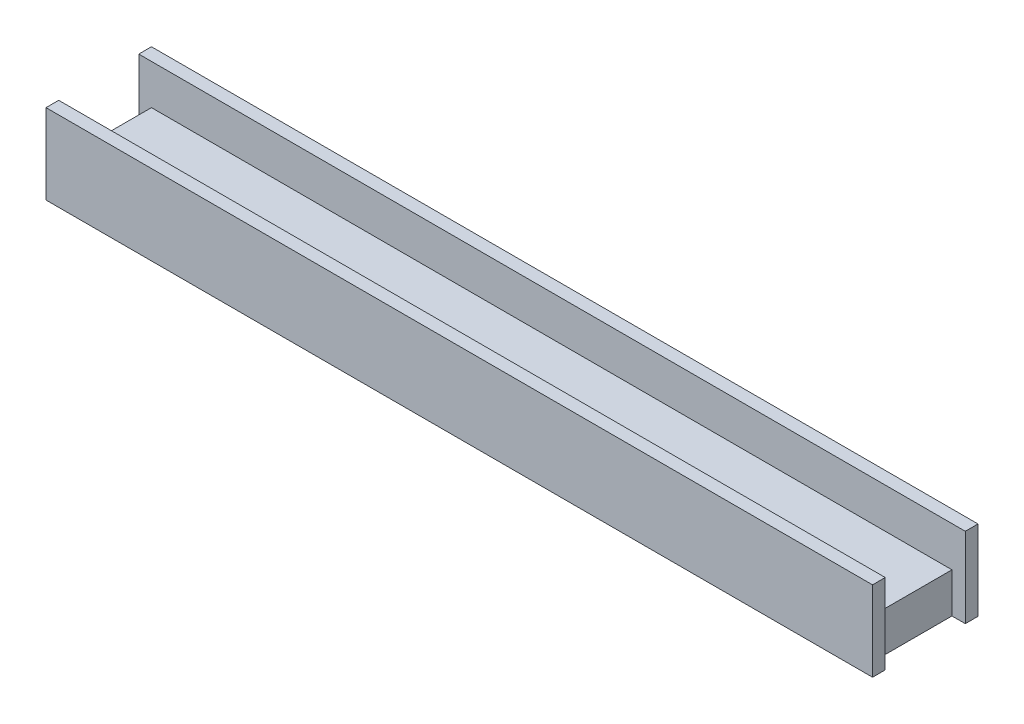
ISO-10303-21;
HEADER;
FILE_DESCRIPTION(('STEP AP214'),'2;1');
FILE_NAME('part.step','',(''),(''),'','','');
FILE_SCHEMA(('AUTOMOTIVE_DESIGN { 1 0 10303 214 1 1 1 1 }'));
ENDSEC;
DATA;
#1=APPLICATION_CONTEXT('core data for automotive mechanical design processes');
#2=APPLICATION_PROTOCOL_DEFINITION('international standard','automotive_design',2000,#1);
#3=PRODUCT_CONTEXT('',#1,'mechanical');
#4=PRODUCT('Part','Part','',(#3));
#5=PRODUCT_RELATED_PRODUCT_CATEGORY('part','',(#4));
#6=PRODUCT_DEFINITION_FORMATION('','',#4);
#7=PRODUCT_DEFINITION_CONTEXT('part definition',#1,'design');
#8=PRODUCT_DEFINITION('design','',#6,#7);
#9=PRODUCT_DEFINITION_SHAPE('','',#8);
#10=(LENGTH_UNIT() NAMED_UNIT(*) SI_UNIT(.MILLI.,.METRE.));
#11=(NAMED_UNIT(*) PLANE_ANGLE_UNIT() SI_UNIT($,.RADIAN.));
#12=(NAMED_UNIT(*) SI_UNIT($,.STERADIAN.) SOLID_ANGLE_UNIT());
#13=UNCERTAINTY_MEASURE_WITH_UNIT(LENGTH_MEASURE(1.E-05),#10,'distance_accuracy_value','');
#14=(GEOMETRIC_REPRESENTATION_CONTEXT(3) GLOBAL_UNCERTAINTY_ASSIGNED_CONTEXT((#13)) GLOBAL_UNIT_ASSIGNED_CONTEXT((#10,
#11,#12)) REPRESENTATION_CONTEXT('',''));
#15=CARTESIAN_POINT('',(0.,0.,0.));
#16=DIRECTION('',(0.,0.,1.));
#17=DIRECTION('',(1.,0.,0.));
#18=AXIS2_PLACEMENT_3D('',#15,#16,#17);
#19=CARTESIAN_POINT('',(50.83283900378,5.,4.999999906));
#20=DIRECTION('',(1.,0.,0.));
#21=DIRECTION('',(0.,0.,-1.));
#22=AXIS2_PLACEMENT_3D('',#19,#20,#21);
#23=PLANE('',#22);
#24=DIRECTION('',(0.,0.,1.));
#25=VECTOR('',#24,1.);
#26=CARTESIAN_POINT('',(50.83283900378,0.,4.999999906));
#27=LINE('',#26,#25);
#28=CARTESIAN_POINT('',(50.83283900378,0.,4.999999906));
#29=VERTEX_POINT('',#28);
#30=CARTESIAN_POINT('',(50.83283900378,0.,5.79374990599999));
#31=VERTEX_POINT('',#30);
#32=EDGE_CURVE('E12',#29,#31,#27,.T.);
#33=ORIENTED_EDGE('',*,*,#32,.F.);
#34=DIRECTION('',(0.,-1.,0.));
#35=VECTOR('',#34,1.);
#36=CARTESIAN_POINT('',(50.83283900378,5.,4.999999906));
#37=LINE('',#36,#35);
#38=CARTESIAN_POINT('',(50.83283900378,5.,4.999999906));
#39=VERTEX_POINT('',#38);
#40=EDGE_CURVE('E105',#39,#29,#37,.T.);
#41=ORIENTED_EDGE('',*,*,#40,.F.);
#42=DIRECTION('',(0.,0.,1.));
#43=VECTOR('',#42,1.);
#44=CARTESIAN_POINT('',(50.83283900378,5.,4.999999906));
#45=LINE('',#44,#43);
#46=CARTESIAN_POINT('',(50.83283900378,5.,5.79374990599999));
#47=VERTEX_POINT('',#46);
#48=EDGE_CURVE('E62',#39,#47,#45,.T.);
#49=ORIENTED_EDGE('',*,*,#48,.T.);
#50=DIRECTION('',(0.,-1.,0.));
#51=VECTOR('',#50,1.);
#52=CARTESIAN_POINT('',(50.83283900378,5.,5.79374990599999));
#53=LINE('',#52,#51);
#54=EDGE_CURVE('E77',#47,#31,#53,.T.);
#55=ORIENTED_EDGE('',*,*,#54,.T.);
#56=EDGE_LOOP('',(#33,#41,#49,#55));
#57=FACE_BOUND('',#56,.T.);
#58=ADVANCED_FACE('F58',(#57),#23,.T.);
#59=CARTESIAN_POINT('',(-0.792660996219982,5.,4.999999906));
#60=DIRECTION('',(0.,0.,-1.));
#61=DIRECTION('',(-1.,0.,0.));
#62=AXIS2_PLACEMENT_3D('',#59,#60,#61);
#63=PLANE('',#62);
#64=DIRECTION('',(1.,0.,0.));
#65=VECTOR('',#64,1.);
#66=CARTESIAN_POINT('',(-0.792660996219982,0.,4.999999906));
#67=LINE('',#66,#65);
#68=CARTESIAN_POINT('',(-0.792660996219982,0.,4.999999906));
#69=VERTEX_POINT('',#68);
#70=EDGE_CURVE('E118',#69,#29,#67,.T.);
#71=ORIENTED_EDGE('',*,*,#70,.F.);
#72=DIRECTION('',(0.,-1.,0.));
#73=VECTOR('',#72,1.);
#74=CARTESIAN_POINT('',(-0.792660996219982,5.,4.999999906));
#75=LINE('',#74,#73);
#76=CARTESIAN_POINT('',(-0.792660996219982,5.,4.999999906));
#77=VERTEX_POINT('',#76);
#78=EDGE_CURVE('E107',#77,#69,#75,.T.);
#79=ORIENTED_EDGE('',*,*,#78,.F.);
#80=DIRECTION('',(1.,0.,0.));
#81=VECTOR('',#80,1.);
#82=CARTESIAN_POINT('',(-0.792660996219982,5.,4.999999906));
#83=LINE('',#82,#81);
#84=EDGE_CURVE('E126',#77,#39,#83,.T.);
#85=ORIENTED_EDGE('',*,*,#84,.T.);
#86=ORIENTED_EDGE('',*,*,#40,.T.);
#87=EDGE_LOOP('',(#71,#79,#85,#86));
#88=FACE_BOUND('',#87,.T.);
#89=ADVANCED_FACE('F120',(#88),#63,.T.);
#90=CARTESIAN_POINT('',(-0.792660996219982,5.,5.793749906));
#91=DIRECTION('',(-1.,0.,0.));
#92=DIRECTION('',(0.,0.,1.));
#93=AXIS2_PLACEMENT_3D('',#90,#91,#92);
#94=PLANE('',#93);
#95=DIRECTION('',(0.,0.,-1.));
#96=VECTOR('',#95,1.);
#97=CARTESIAN_POINT('',(-0.792660996219982,0.,5.793749906));
#98=LINE('',#97,#96);
#99=CARTESIAN_POINT('',(-0.792660996219982,0.,5.793749906));
#100=VERTEX_POINT('',#99);
#101=EDGE_CURVE('E110',#100,#69,#98,.T.);
#102=ORIENTED_EDGE('',*,*,#101,.F.);
#103=DIRECTION('',(0.,-1.,0.));
#104=VECTOR('',#103,1.);
#105=CARTESIAN_POINT('',(-0.792660996219982,5.,5.793749906));
#106=LINE('',#105,#104);
#107=CARTESIAN_POINT('',(-0.792660996219982,5.,5.793749906));
#108=VERTEX_POINT('',#107);
#109=EDGE_CURVE('E94',#108,#100,#106,.T.);
#110=ORIENTED_EDGE('',*,*,#109,.F.);
#111=DIRECTION('',(0.,0.,-1.));
#112=VECTOR('',#111,1.);
#113=CARTESIAN_POINT('',(-0.792660996219982,5.,5.793749906));
#114=LINE('',#113,#112);
#115=EDGE_CURVE('E112',#108,#77,#114,.T.);
#116=ORIENTED_EDGE('',*,*,#115,.T.);
#117=ORIENTED_EDGE('',*,*,#78,.T.);
#118=EDGE_LOOP('',(#102,#110,#116,#117));
#119=FACE_BOUND('',#118,.T.);
#120=ADVANCED_FACE('F109',(#119),#94,.T.);
#121=CARTESIAN_POINT('',(50.83283900378,5.,5.79374990599999));
#122=DIRECTION('',(0.,0.,1.));
#123=DIRECTION('',(1.,0.,0.));
#124=AXIS2_PLACEMENT_3D('',#121,#122,#123);
#125=PLANE('',#124);
#126=DIRECTION('',(-1.,0.,0.));
#127=VECTOR('',#126,1.);
#128=CARTESIAN_POINT('',(50.83283900378,0.,5.79374990599999));
#129=LINE('',#128,#127);
#130=EDGE_CURVE('E68',#31,#100,#129,.T.);
#131=ORIENTED_EDGE('',*,*,#130,.F.);
#132=ORIENTED_EDGE('',*,*,#54,.F.);
#133=DIRECTION('',(-1.,0.,0.));
#134=VECTOR('',#133,1.);
#135=CARTESIAN_POINT('',(50.83283900378,5.,5.79374990599999));
#136=LINE('',#135,#134);
#137=EDGE_CURVE('E122',#47,#108,#136,.T.);
#138=ORIENTED_EDGE('',*,*,#137,.T.);
#139=ORIENTED_EDGE('',*,*,#109,.T.);
#140=EDGE_LOOP('',(#131,#132,#138,#139));
#141=FACE_BOUND('',#140,.T.);
#142=ADVANCED_FACE('F128',(#141),#125,.T.);
#143=CARTESIAN_POINT('',(0.,5.,0.));
#144=DIRECTION('',(0.,-1.,0.));
#145=DIRECTION('',(0.,0.,-1.));
#146=AXIS2_PLACEMENT_3D('',#143,#144,#145);
#147=PLANE('',#146);
#148=ORIENTED_EDGE('',*,*,#48,.F.);
#149=ORIENTED_EDGE('',*,*,#84,.F.);
#150=ORIENTED_EDGE('',*,*,#115,.F.);
#151=ORIENTED_EDGE('',*,*,#137,.F.);
#152=EDGE_LOOP('',(#148,#149,#150,#151));
#153=FACE_BOUND('',#152,.T.);
#154=ADVANCED_FACE('F60',(#153),#147,.F.);
#155=CARTESIAN_POINT('',(0.,0.,0.));
#156=DIRECTION('',(0.,-1.,0.));
#157=DIRECTION('',(0.,0.,-1.));
#158=AXIS2_PLACEMENT_3D('',#155,#156,#157);
#159=PLANE('',#158);
#160=ORIENTED_EDGE('',*,*,#32,.T.);
#161=ORIENTED_EDGE('',*,*,#130,.T.);
#162=ORIENTED_EDGE('',*,*,#101,.T.);
#163=ORIENTED_EDGE('',*,*,#70,.T.);
#164=EDGE_LOOP('',(#160,#161,#162,#163));
#165=FACE_BOUND('',#164,.T.);
#166=ADVANCED_FACE('F117',(#165),#159,.T.);
#167=CLOSED_SHELL('',(#58,#89,#120,#142,#154,#166));
#168=MANIFOLD_SOLID_BREP('B2',#167);
#169=CARTESIAN_POINT('',(50.83283900378,5.,0.));
#170=DIRECTION('',(1.,0.,0.));
#171=DIRECTION('',(0.,0.,-1.));
#172=AXIS2_PLACEMENT_3D('',#169,#170,#171);
#173=PLANE('',#172);
#174=DIRECTION('',(0.,0.,1.));
#175=VECTOR('',#174,1.);
#176=CARTESIAN_POINT('',(50.83283900378,0.,0.));
#177=LINE('',#176,#175);
#178=CARTESIAN_POINT('',(50.83283900378,0.,-0.79375));
#179=VERTEX_POINT('',#178);
#180=CARTESIAN_POINT('',(50.83283900378,0.,0.));
#181=VERTEX_POINT('',#180);
#182=EDGE_CURVE('E272',#179,#181,#177,.T.);
#183=ORIENTED_EDGE('',*,*,#182,.F.);
#184=DIRECTION('',(0.,-1.,0.));
#185=VECTOR('',#184,1.);
#186=CARTESIAN_POINT('',(50.83283900378,5.,-0.79375));
#187=LINE('',#186,#185);
#188=CARTESIAN_POINT('',(50.83283900378,5.,-0.79375));
#189=VERTEX_POINT('',#188);
#190=EDGE_CURVE('E56',#189,#179,#187,.T.);
#191=ORIENTED_EDGE('',*,*,#190,.F.);
#192=DIRECTION('',(0.,0.,1.));
#193=VECTOR('',#192,1.);
#194=CARTESIAN_POINT('',(50.83283900378,5.,0.));
#195=LINE('',#194,#193);
#196=CARTESIAN_POINT('',(50.83283900378,5.,0.));
#197=VERTEX_POINT('',#196);
#198=EDGE_CURVE('E263',#189,#197,#195,.T.);
#199=ORIENTED_EDGE('',*,*,#198,.T.);
#200=DIRECTION('',(0.,-1.,0.));
#201=VECTOR('',#200,1.);
#202=CARTESIAN_POINT('',(50.83283900378,5.,0.));
#203=LINE('',#202,#201);
#204=EDGE_CURVE('E242',#197,#181,#203,.T.);
#205=ORIENTED_EDGE('',*,*,#204,.T.);
#206=EDGE_LOOP('',(#183,#191,#199,#205));
#207=FACE_BOUND('',#206,.T.);
#208=ADVANCED_FACE('F203',(#207),#173,.T.);
#209=CARTESIAN_POINT('',(0.,5.,-0.79375));
#210=DIRECTION('',(0.,0.,-1.));
#211=DIRECTION('',(-1.,0.,0.));
#212=AXIS2_PLACEMENT_3D('',#209,#210,#211);
#213=PLANE('',#212);
#214=DIRECTION('',(1.,0.,0.));
#215=VECTOR('',#214,1.);
#216=CARTESIAN_POINT('',(0.,0.,-0.79375));
#217=LINE('',#216,#215);
#218=CARTESIAN_POINT('',(-0.792660996219982,0.,-0.79375));
#219=VERTEX_POINT('',#218);
#220=EDGE_CURVE('E255',#219,#179,#217,.T.);
#221=ORIENTED_EDGE('',*,*,#220,.F.);
#222=DIRECTION('',(0.,-1.,0.));
#223=VECTOR('',#222,1.);
#224=CARTESIAN_POINT('',(-0.792660996219982,5.,-0.79375));
#225=LINE('',#224,#223);
#226=CARTESIAN_POINT('',(-0.792660996219982,5.,-0.79375));
#227=VERTEX_POINT('',#226);
#228=EDGE_CURVE('E212',#227,#219,#225,.T.);
#229=ORIENTED_EDGE('',*,*,#228,.F.);
#230=DIRECTION('',(1.,0.,0.));
#231=VECTOR('',#230,1.);
#232=CARTESIAN_POINT('',(0.,5.,-0.79375));
#233=LINE('',#232,#231);
#234=EDGE_CURVE('E253',#227,#189,#233,.T.);
#235=ORIENTED_EDGE('',*,*,#234,.T.);
#236=ORIENTED_EDGE('',*,*,#190,.T.);
#237=EDGE_LOOP('',(#221,#229,#235,#236));
#238=FACE_BOUND('',#237,.T.);
#239=ADVANCED_FACE('F251',(#238),#213,.T.);
#240=CARTESIAN_POINT('',(-0.792660996219982,5.,0.));
#241=DIRECTION('',(1.,0.,0.));
#242=DIRECTION('',(0.,0.,-1.));
#243=AXIS2_PLACEMENT_3D('',#240,#241,#242);
#244=PLANE('',#243);
#245=DIRECTION('',(0.,0.,1.));
#246=VECTOR('',#245,1.);
#247=CARTESIAN_POINT('',(-0.792660996219982,0.,0.));
#248=LINE('',#247,#246);
#249=CARTESIAN_POINT('',(-0.792660996219982,0.,0.));
#250=VERTEX_POINT('',#249);
#251=EDGE_CURVE('E235',#219,#250,#248,.T.);
#252=ORIENTED_EDGE('',*,*,#251,.T.);
#253=DIRECTION('',(0.,-1.,0.));
#254=VECTOR('',#253,1.);
#255=CARTESIAN_POINT('',(-0.792660996219982,5.,0.));
#256=LINE('',#255,#254);
#257=CARTESIAN_POINT('',(-0.792660996219982,5.,0.));
#258=VERTEX_POINT('',#257);
#259=EDGE_CURVE('E257',#258,#250,#256,.T.);
#260=ORIENTED_EDGE('',*,*,#259,.F.);
#261=DIRECTION('',(0.,0.,1.));
#262=VECTOR('',#261,1.);
#263=CARTESIAN_POINT('',(-0.792660996219982,5.,0.));
#264=LINE('',#263,#262);
#265=EDGE_CURVE('E258',#227,#258,#264,.T.);
#266=ORIENTED_EDGE('',*,*,#265,.F.);
#267=ORIENTED_EDGE('',*,*,#228,.T.);
#268=EDGE_LOOP('',(#252,#260,#266,#267));
#269=FACE_BOUND('',#268,.T.);
#270=ADVANCED_FACE('F259',(#269),#244,.F.);
#271=CARTESIAN_POINT('',(0.,5.,0.));
#272=DIRECTION('',(0.,0.,-1.));
#273=DIRECTION('',(-1.,0.,0.));
#274=AXIS2_PLACEMENT_3D('',#271,#272,#273);
#275=PLANE('',#274);
#276=DIRECTION('',(1.,0.,0.));
#277=VECTOR('',#276,1.);
#278=CARTESIAN_POINT('',(0.,0.,0.));
#279=LINE('',#278,#277);
#280=EDGE_CURVE('E267',#250,#181,#279,.T.);
#281=ORIENTED_EDGE('',*,*,#280,.T.);
#282=ORIENTED_EDGE('',*,*,#204,.F.);
#283=DIRECTION('',(1.,0.,0.));
#284=VECTOR('',#283,1.);
#285=CARTESIAN_POINT('',(0.,5.,0.));
#286=LINE('',#285,#284);
#287=EDGE_CURVE('E220',#258,#197,#286,.T.);
#288=ORIENTED_EDGE('',*,*,#287,.F.);
#289=ORIENTED_EDGE('',*,*,#259,.T.);
#290=EDGE_LOOP('',(#281,#282,#288,#289));
#291=FACE_BOUND('',#290,.T.);
#292=ADVANCED_FACE('F287',(#291),#275,.F.);
#293=CARTESIAN_POINT('',(0.,5.,0.));
#294=DIRECTION('',(0.,1.,0.));
#295=DIRECTION('',(0.,0.,1.));
#296=AXIS2_PLACEMENT_3D('',#293,#294,#295);
#297=PLANE('',#296);
#298=ORIENTED_EDGE('',*,*,#198,.F.);
#299=ORIENTED_EDGE('',*,*,#234,.F.);
#300=ORIENTED_EDGE('',*,*,#265,.T.);
#301=ORIENTED_EDGE('',*,*,#287,.T.);
#302=EDGE_LOOP('',(#298,#299,#300,#301));
#303=FACE_BOUND('',#302,.T.);
#304=ADVANCED_FACE('F262',(#303),#297,.T.);
#305=CARTESIAN_POINT('',(0.,0.,0.));
#306=DIRECTION('',(0.,1.,0.));
#307=DIRECTION('',(0.,0.,1.));
#308=AXIS2_PLACEMENT_3D('',#305,#306,#307);
#309=PLANE('',#308);
#310=ORIENTED_EDGE('',*,*,#182,.T.);
#311=ORIENTED_EDGE('',*,*,#280,.F.);
#312=ORIENTED_EDGE('',*,*,#251,.F.);
#313=ORIENTED_EDGE('',*,*,#220,.T.);
#314=EDGE_LOOP('',(#310,#311,#312,#313));
#315=FACE_BOUND('',#314,.T.);
#316=ADVANCED_FACE('F289',(#315),#309,.F.);
#317=CLOSED_SHELL('',(#208,#239,#270,#292,#304,#316));
#318=MANIFOLD_SOLID_BREP('B6',#317);
#319=CARTESIAN_POINT('',(50.,2.5,0.));
#320=DIRECTION('',(1.,0.,0.));
#321=DIRECTION('',(0.,0.,-1.));
#322=AXIS2_PLACEMENT_3D('',#319,#320,#321);
#323=PLANE('',#322);
#324=DIRECTION('',(0.,0.,1.));
#325=VECTOR('',#324,1.);
#326=CARTESIAN_POINT('',(50.,0.,0.));
#327=LINE('',#326,#325);
#328=CARTESIAN_POINT('',(50.,0.,0.));
#329=VERTEX_POINT('',#328);
#330=CARTESIAN_POINT('',(50.,0.,4.999999906));
#331=VERTEX_POINT('',#330);
#332=EDGE_CURVE('E417',#329,#331,#327,.T.);
#333=ORIENTED_EDGE('',*,*,#332,.F.);
#334=DIRECTION('',(0.,-1.,0.));
#335=VECTOR('',#334,1.);
#336=CARTESIAN_POINT('',(50.,2.5,0.));
#337=LINE('',#336,#335);
#338=CARTESIAN_POINT('',(50.,2.5,0.));
#339=VERTEX_POINT('',#338);
#340=EDGE_CURVE('E201',#339,#329,#337,.T.);
#341=ORIENTED_EDGE('',*,*,#340,.F.);
#342=DIRECTION('',(0.,0.,1.));
#343=VECTOR('',#342,1.);
#344=CARTESIAN_POINT('',(50.,2.5,0.));
#345=LINE('',#344,#343);
#346=CARTESIAN_POINT('',(50.,2.5,4.999999906));
#347=VERTEX_POINT('',#346);
#348=EDGE_CURVE('E411',#339,#347,#345,.T.);
#349=ORIENTED_EDGE('',*,*,#348,.T.);
#350=DIRECTION('',(0.,-1.,0.));
#351=VECTOR('',#350,1.);
#352=CARTESIAN_POINT('',(50.,2.5,4.999999906));
#353=LINE('',#352,#351);
#354=EDGE_CURVE('E392',#347,#331,#353,.T.);
#355=ORIENTED_EDGE('',*,*,#354,.T.);
#356=EDGE_LOOP('',(#333,#341,#349,#355));
#357=FACE_BOUND('',#356,.T.);
#358=ADVANCED_FACE('F354',(#357),#323,.T.);
#359=CARTESIAN_POINT('',(0.,2.5,0.));
#360=DIRECTION('',(0.,0.,-1.));
#361=DIRECTION('',(-1.,0.,0.));
#362=AXIS2_PLACEMENT_3D('',#359,#360,#361);
#363=PLANE('',#362);
#364=DIRECTION('',(1.,0.,0.));
#365=VECTOR('',#364,1.);
#366=CARTESIAN_POINT('',(0.,0.,0.));
#367=LINE('',#366,#365);
#368=CARTESIAN_POINT('',(0.,0.,0.));
#369=VERTEX_POINT('',#368);
#370=EDGE_CURVE('E405',#369,#329,#367,.T.);
#371=ORIENTED_EDGE('',*,*,#370,.F.);
#372=DIRECTION('',(0.,-1.,0.));
#373=VECTOR('',#372,1.);
#374=CARTESIAN_POINT('',(0.,2.5,0.));
#375=LINE('',#374,#373);
#376=CARTESIAN_POINT('',(0.,2.5,0.));
#377=VERTEX_POINT('',#376);
#378=EDGE_CURVE('E362',#377,#369,#375,.T.);
#379=ORIENTED_EDGE('',*,*,#378,.F.);
#380=DIRECTION('',(1.,0.,0.));
#381=VECTOR('',#380,1.);
#382=CARTESIAN_POINT('',(0.,2.5,0.));
#383=LINE('',#382,#381);
#384=EDGE_CURVE('E403',#377,#339,#383,.T.);
#385=ORIENTED_EDGE('',*,*,#384,.T.);
#386=ORIENTED_EDGE('',*,*,#340,.T.);
#387=EDGE_LOOP('',(#371,#379,#385,#386));
#388=FACE_BOUND('',#387,.T.);
#389=ADVANCED_FACE('F401',(#388),#363,.T.);
#390=CARTESIAN_POINT('',(0.,2.5,0.));
#391=DIRECTION('',(1.,0.,0.));
#392=DIRECTION('',(0.,0.,-1.));
#393=AXIS2_PLACEMENT_3D('',#390,#391,#392);
#394=PLANE('',#393);
#395=DIRECTION('',(0.,0.,1.));
#396=VECTOR('',#395,1.);
#397=CARTESIAN_POINT('',(0.,0.,0.));
#398=LINE('',#397,#396);
#399=CARTESIAN_POINT('',(0.,0.,4.999999906));
#400=VERTEX_POINT('',#399);
#401=EDGE_CURVE('E385',#369,#400,#398,.T.);
#402=ORIENTED_EDGE('',*,*,#401,.T.);
#403=DIRECTION('',(0.,-1.,0.));
#404=VECTOR('',#403,1.);
#405=CARTESIAN_POINT('',(0.,2.5,4.999999906));
#406=LINE('',#405,#404);
#407=CARTESIAN_POINT('',(0.,2.5,4.999999906));
#408=VERTEX_POINT('',#407);
#409=EDGE_CURVE('E406',#408,#400,#406,.T.);
#410=ORIENTED_EDGE('',*,*,#409,.F.);
#411=DIRECTION('',(0.,0.,1.));
#412=VECTOR('',#411,1.);
#413=CARTESIAN_POINT('',(0.,2.5,0.));
#414=LINE('',#413,#412);
#415=EDGE_CURVE('E407',#377,#408,#414,.T.);
#416=ORIENTED_EDGE('',*,*,#415,.F.);
#417=ORIENTED_EDGE('',*,*,#378,.T.);
#418=EDGE_LOOP('',(#402,#410,#416,#417));
#419=FACE_BOUND('',#418,.T.);
#420=ADVANCED_FACE('F408',(#419),#394,.F.);
#421=CARTESIAN_POINT('',(0.,2.5,4.999999906));
#422=DIRECTION('',(0.,0.,-1.));
#423=DIRECTION('',(-1.,0.,0.));
#424=AXIS2_PLACEMENT_3D('',#421,#422,#423);
#425=PLANE('',#424);
#426=DIRECTION('',(1.,0.,0.));
#427=VECTOR('',#426,1.);
#428=CARTESIAN_POINT('',(0.,0.,4.999999906));
#429=LINE('',#428,#427);
#430=EDGE_CURVE('E413',#400,#331,#429,.T.);
#431=ORIENTED_EDGE('',*,*,#430,.T.);
#432=ORIENTED_EDGE('',*,*,#354,.F.);
#433=DIRECTION('',(1.,0.,0.));
#434=VECTOR('',#433,1.);
#435=CARTESIAN_POINT('',(0.,2.5,4.999999906));
#436=LINE('',#435,#434);
#437=EDGE_CURVE('E370',#408,#347,#436,.T.);
#438=ORIENTED_EDGE('',*,*,#437,.F.);
#439=ORIENTED_EDGE('',*,*,#409,.T.);
#440=EDGE_LOOP('',(#431,#432,#438,#439));
#441=FACE_BOUND('',#440,.T.);
#442=ADVANCED_FACE('F426',(#441),#425,.F.);
#443=CARTESIAN_POINT('',(0.,2.5,0.));
#444=DIRECTION('',(0.,1.,0.));
#445=DIRECTION('',(0.,0.,1.));
#446=AXIS2_PLACEMENT_3D('',#443,#444,#445);
#447=PLANE('',#446);
#448=ORIENTED_EDGE('',*,*,#348,.F.);
#449=ORIENTED_EDGE('',*,*,#384,.F.);
#450=ORIENTED_EDGE('',*,*,#415,.T.);
#451=ORIENTED_EDGE('',*,*,#437,.T.);
#452=EDGE_LOOP('',(#448,#449,#450,#451));
#453=FACE_BOUND('',#452,.T.);
#454=ADVANCED_FACE('F410',(#453),#447,.T.);
#455=CARTESIAN_POINT('',(0.,0.,0.));
#456=DIRECTION('',(0.,1.,0.));
#457=DIRECTION('',(0.,0.,1.));
#458=AXIS2_PLACEMENT_3D('',#455,#456,#457);
#459=PLANE('',#458);
#460=ORIENTED_EDGE('',*,*,#332,.T.);
#461=ORIENTED_EDGE('',*,*,#430,.F.);
#462=ORIENTED_EDGE('',*,*,#401,.F.);
#463=ORIENTED_EDGE('',*,*,#370,.T.);
#464=EDGE_LOOP('',(#460,#461,#462,#463));
#465=FACE_BOUND('',#464,.T.);
#466=ADVANCED_FACE('F428',(#465),#459,.F.);
#467=CLOSED_SHELL('',(#358,#389,#420,#442,#454,#466));
#468=MANIFOLD_SOLID_BREP('B50',#467);
#469=ADVANCED_BREP_SHAPE_REPRESENTATION('',(#18,#168,#318,#468),#14);
#470=SHAPE_DEFINITION_REPRESENTATION(#9,#469);
ENDSEC;
END-ISO-10303-21;
